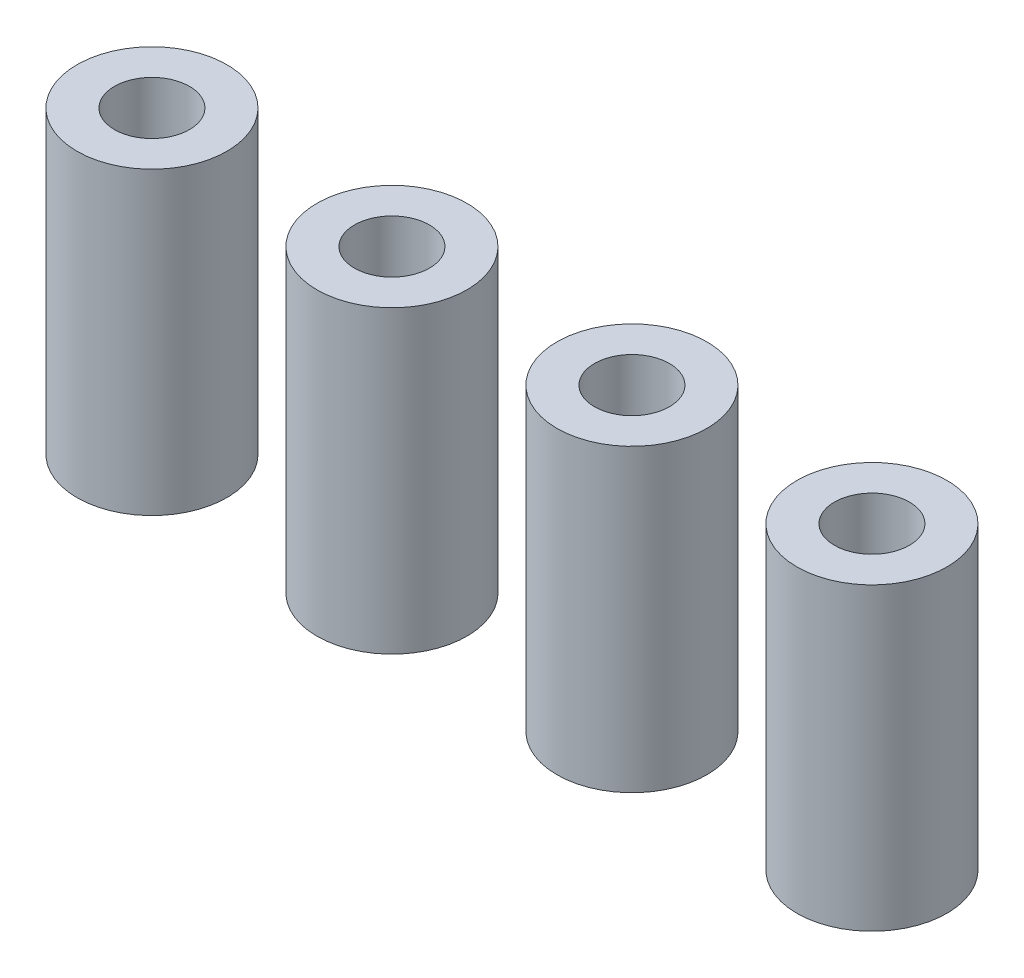
ISO-10303-21;
HEADER;
FILE_DESCRIPTION(('STEP AP214'),'2;1');
FILE_NAME('part.step','',(''),(''),'','','');
FILE_SCHEMA(('AUTOMOTIVE_DESIGN { 1 0 10303 214 1 1 1 1 }'));
ENDSEC;
DATA;
#1=APPLICATION_CONTEXT('core data for automotive mechanical design processes');
#2=APPLICATION_PROTOCOL_DEFINITION('international standard','automotive_design',2000,#1);
#3=PRODUCT_CONTEXT('',#1,'mechanical');
#4=PRODUCT('Part','Part','',(#3));
#5=PRODUCT_RELATED_PRODUCT_CATEGORY('part','',(#4));
#6=PRODUCT_DEFINITION_FORMATION('','',#4);
#7=PRODUCT_DEFINITION_CONTEXT('part definition',#1,'design');
#8=PRODUCT_DEFINITION('design','',#6,#7);
#9=PRODUCT_DEFINITION_SHAPE('','',#8);
#10=(LENGTH_UNIT() NAMED_UNIT(*) SI_UNIT(.MILLI.,.METRE.));
#11=(NAMED_UNIT(*) PLANE_ANGLE_UNIT() SI_UNIT($,.RADIAN.));
#12=(NAMED_UNIT(*) SI_UNIT($,.STERADIAN.) SOLID_ANGLE_UNIT());
#13=UNCERTAINTY_MEASURE_WITH_UNIT(LENGTH_MEASURE(1.E-05),#10,'distance_accuracy_value','');
#14=(GEOMETRIC_REPRESENTATION_CONTEXT(3) GLOBAL_UNCERTAINTY_ASSIGNED_CONTEXT((#13)) GLOBAL_UNIT_ASSIGNED_CONTEXT((#10,
#11,#12)) REPRESENTATION_CONTEXT('',''));
#15=CARTESIAN_POINT('',(0.,0.,0.));
#16=DIRECTION('',(0.,0.,1.));
#17=DIRECTION('',(1.,0.,0.));
#18=AXIS2_PLACEMENT_3D('',#15,#16,#17);
#19=CARTESIAN_POINT('',(24.,10.,0.));
#20=DIRECTION('',(0.,1.,0.));
#21=DIRECTION('',(0.,0.,1.));
#22=AXIS2_PLACEMENT_3D('',#19,#20,#21);
#23=PLANE('',#22);
#24=CARTESIAN_POINT('',(24.,10.,0.));
#25=DIRECTION('',(0.,1.,0.));
#26=DIRECTION('',(0.,0.,1.));
#27=AXIS2_PLACEMENT_3D('',#24,#25,#26);
#28=CIRCLE('',#27,2.5);
#29=CARTESIAN_POINT('',(24.,10.,2.5));
#30=VERTEX_POINT('',#29);
#31=EDGE_CURVE('E11',#30,#30,#28,.T.);
#32=ORIENTED_EDGE('',*,*,#31,.T.);
#33=EDGE_LOOP('',(#32));
#34=FACE_BOUND('',#33,.T.);
#35=CARTESIAN_POINT('',(24.,10.,0.));
#36=DIRECTION('',(0.,1.,0.));
#37=DIRECTION('',(0.,0.,1.));
#38=AXIS2_PLACEMENT_3D('',#35,#36,#37);
#39=CIRCLE('',#38,1.25);
#40=CARTESIAN_POINT('',(24.,10.,1.25));
#41=VERTEX_POINT('',#40);
#42=EDGE_CURVE('E57',#41,#41,#39,.T.);
#43=ORIENTED_EDGE('',*,*,#42,.F.);
#44=EDGE_LOOP('',(#43));
#45=FACE_BOUND('',#44,.T.);
#46=ADVANCED_FACE('F46',(#34,#45),#23,.T.);
#47=CARTESIAN_POINT('',(24.,0.,0.));
#48=DIRECTION('',(0.,1.,0.));
#49=DIRECTION('',(0.,0.,1.));
#50=AXIS2_PLACEMENT_3D('',#47,#48,#49);
#51=PLANE('',#50);
#52=CARTESIAN_POINT('',(24.,0.,0.));
#53=DIRECTION('',(0.,1.,0.));
#54=DIRECTION('',(0.,0.,1.));
#55=AXIS2_PLACEMENT_3D('',#52,#53,#54);
#56=CIRCLE('',#55,2.5);
#57=CARTESIAN_POINT('',(24.,0.,2.5));
#58=VERTEX_POINT('',#57);
#59=EDGE_CURVE('E50',#58,#58,#56,.T.);
#60=ORIENTED_EDGE('',*,*,#59,.F.);
#61=EDGE_LOOP('',(#60));
#62=FACE_BOUND('',#61,.T.);
#63=CARTESIAN_POINT('',(24.,0.,0.));
#64=DIRECTION('',(0.,1.,0.));
#65=DIRECTION('',(0.,0.,1.));
#66=AXIS2_PLACEMENT_3D('',#63,#64,#65);
#67=CIRCLE('',#66,1.25);
#68=CARTESIAN_POINT('',(24.,0.,1.25));
#69=VERTEX_POINT('',#68);
#70=EDGE_CURVE('E59',#69,#69,#67,.T.);
#71=ORIENTED_EDGE('',*,*,#70,.T.);
#72=EDGE_LOOP('',(#71));
#73=FACE_BOUND('',#72,.T.);
#74=ADVANCED_FACE('F69',(#62,#73),#51,.F.);
#75=CARTESIAN_POINT('',(24.,10.,0.));
#76=DIRECTION('',(0.,-1.,0.));
#77=DIRECTION('',(0.,0.,-1.));
#78=AXIS2_PLACEMENT_3D('',#75,#76,#77);
#79=CYLINDRICAL_SURFACE('',#78,2.5);
#80=ORIENTED_EDGE('',*,*,#31,.F.);
#81=EDGE_LOOP('',(#80));
#82=FACE_BOUND('',#81,.T.);
#83=ORIENTED_EDGE('',*,*,#59,.T.);
#84=EDGE_LOOP('',(#83));
#85=FACE_BOUND('',#84,.T.);
#86=ADVANCED_FACE('F48',(#82,#85),#79,.T.);
#87=CARTESIAN_POINT('',(24.,10.,0.));
#88=DIRECTION('',(0.,-1.,0.));
#89=DIRECTION('',(0.,0.,-1.));
#90=AXIS2_PLACEMENT_3D('',#87,#88,#89);
#91=CYLINDRICAL_SURFACE('',#90,1.25);
#92=ORIENTED_EDGE('',*,*,#42,.T.);
#93=EDGE_LOOP('',(#92));
#94=FACE_BOUND('',#93,.T.);
#95=ORIENTED_EDGE('',*,*,#70,.F.);
#96=EDGE_LOOP('',(#95));
#97=FACE_BOUND('',#96,.T.);
#98=ADVANCED_FACE('F65',(#94,#97),#91,.F.);
#99=CLOSED_SHELL('',(#46,#74,#86,#98));
#100=MANIFOLD_SOLID_BREP('B2',#99);
#101=CARTESIAN_POINT('',(16.,10.,0.));
#102=DIRECTION('',(0.,1.,0.));
#103=DIRECTION('',(0.,0.,1.));
#104=AXIS2_PLACEMENT_3D('',#101,#102,#103);
#105=PLANE('',#104);
#106=CARTESIAN_POINT('',(16.,10.,0.));
#107=DIRECTION('',(0.,1.,0.));
#108=DIRECTION('',(0.,0.,1.));
#109=AXIS2_PLACEMENT_3D('',#106,#107,#108);
#110=CIRCLE('',#109,2.5);
#111=CARTESIAN_POINT('',(16.,10.,2.5));
#112=VERTEX_POINT('',#111);
#113=EDGE_CURVE('E45',#112,#112,#110,.T.);
#114=ORIENTED_EDGE('',*,*,#113,.T.);
#115=EDGE_LOOP('',(#114));
#116=FACE_BOUND('',#115,.T.);
#117=CARTESIAN_POINT('',(16.,10.,0.));
#118=DIRECTION('',(0.,1.,0.));
#119=DIRECTION('',(0.,0.,1.));
#120=AXIS2_PLACEMENT_3D('',#117,#118,#119);
#121=CIRCLE('',#120,1.25);
#122=CARTESIAN_POINT('',(16.,10.,1.25));
#123=VERTEX_POINT('',#122);
#124=EDGE_CURVE('E129',#123,#123,#121,.T.);
#125=ORIENTED_EDGE('',*,*,#124,.F.);
#126=EDGE_LOOP('',(#125));
#127=FACE_BOUND('',#126,.T.);
#128=ADVANCED_FACE('F116',(#116,#127),#105,.T.);
#129=CARTESIAN_POINT('',(16.,0.,0.));
#130=DIRECTION('',(0.,1.,0.));
#131=DIRECTION('',(0.,0.,1.));
#132=AXIS2_PLACEMENT_3D('',#129,#130,#131);
#133=PLANE('',#132);
#134=CARTESIAN_POINT('',(16.,0.,0.));
#135=DIRECTION('',(0.,1.,0.));
#136=DIRECTION('',(0.,0.,1.));
#137=AXIS2_PLACEMENT_3D('',#134,#135,#136);
#138=CIRCLE('',#137,2.5);
#139=CARTESIAN_POINT('',(16.,0.,2.5));
#140=VERTEX_POINT('',#139);
#141=EDGE_CURVE('E120',#140,#140,#138,.T.);
#142=ORIENTED_EDGE('',*,*,#141,.F.);
#143=EDGE_LOOP('',(#142));
#144=FACE_BOUND('',#143,.T.);
#145=CARTESIAN_POINT('',(16.,0.,0.));
#146=DIRECTION('',(0.,1.,0.));
#147=DIRECTION('',(0.,0.,1.));
#148=AXIS2_PLACEMENT_3D('',#145,#146,#147);
#149=CIRCLE('',#148,1.25);
#150=CARTESIAN_POINT('',(16.,0.,1.25));
#151=VERTEX_POINT('',#150);
#152=EDGE_CURVE('E131',#151,#151,#149,.T.);
#153=ORIENTED_EDGE('',*,*,#152,.T.);
#154=EDGE_LOOP('',(#153));
#155=FACE_BOUND('',#154,.T.);
#156=ADVANCED_FACE('F143',(#144,#155),#133,.F.);
#157=CARTESIAN_POINT('',(16.,10.,0.));
#158=DIRECTION('',(0.,-1.,0.));
#159=DIRECTION('',(0.,0.,-1.));
#160=AXIS2_PLACEMENT_3D('',#157,#158,#159);
#161=CYLINDRICAL_SURFACE('',#160,2.5);
#162=ORIENTED_EDGE('',*,*,#113,.F.);
#163=EDGE_LOOP('',(#162));
#164=FACE_BOUND('',#163,.T.);
#165=ORIENTED_EDGE('',*,*,#141,.T.);
#166=EDGE_LOOP('',(#165));
#167=FACE_BOUND('',#166,.T.);
#168=ADVANCED_FACE('F118',(#164,#167),#161,.T.);
#169=CARTESIAN_POINT('',(16.,10.,0.));
#170=DIRECTION('',(0.,-1.,0.));
#171=DIRECTION('',(0.,0.,-1.));
#172=AXIS2_PLACEMENT_3D('',#169,#170,#171);
#173=CYLINDRICAL_SURFACE('',#172,1.25);
#174=ORIENTED_EDGE('',*,*,#124,.T.);
#175=EDGE_LOOP('',(#174));
#176=FACE_BOUND('',#175,.T.);
#177=ORIENTED_EDGE('',*,*,#152,.F.);
#178=EDGE_LOOP('',(#177));
#179=FACE_BOUND('',#178,.T.);
#180=ADVANCED_FACE('F139',(#176,#179),#173,.F.);
#181=CLOSED_SHELL('',(#128,#156,#168,#180));
#182=MANIFOLD_SOLID_BREP('B6',#181);
#183=CARTESIAN_POINT('',(8.,10.,0.));
#184=DIRECTION('',(0.,1.,0.));
#185=DIRECTION('',(0.,0.,1.));
#186=AXIS2_PLACEMENT_3D('',#183,#184,#185);
#187=PLANE('',#186);
#188=CARTESIAN_POINT('',(8.,10.,0.));
#189=DIRECTION('',(0.,1.,0.));
#190=DIRECTION('',(0.,0.,1.));
#191=AXIS2_PLACEMENT_3D('',#188,#189,#190);
#192=CIRCLE('',#191,2.5);
#193=CARTESIAN_POINT('',(8.,10.,2.5));
#194=VERTEX_POINT('',#193);
#195=EDGE_CURVE('E115',#194,#194,#192,.T.);
#196=ORIENTED_EDGE('',*,*,#195,.T.);
#197=EDGE_LOOP('',(#196));
#198=FACE_BOUND('',#197,.T.);
#199=CARTESIAN_POINT('',(8.,10.,0.));
#200=DIRECTION('',(0.,1.,0.));
#201=DIRECTION('',(0.,0.,1.));
#202=AXIS2_PLACEMENT_3D('',#199,#200,#201);
#203=CIRCLE('',#202,1.25);
#204=CARTESIAN_POINT('',(8.,10.,1.25));
#205=VERTEX_POINT('',#204);
#206=EDGE_CURVE('E200',#205,#205,#203,.T.);
#207=ORIENTED_EDGE('',*,*,#206,.F.);
#208=EDGE_LOOP('',(#207));
#209=FACE_BOUND('',#208,.T.);
#210=ADVANCED_FACE('F189',(#198,#209),#187,.T.);
#211=CARTESIAN_POINT('',(8.,0.,0.));
#212=DIRECTION('',(0.,1.,0.));
#213=DIRECTION('',(0.,0.,1.));
#214=AXIS2_PLACEMENT_3D('',#211,#212,#213);
#215=PLANE('',#214);
#216=CARTESIAN_POINT('',(8.,0.,0.));
#217=DIRECTION('',(0.,1.,0.));
#218=DIRECTION('',(0.,0.,1.));
#219=AXIS2_PLACEMENT_3D('',#216,#217,#218);
#220=CIRCLE('',#219,2.5);
#221=CARTESIAN_POINT('',(8.,0.,2.5));
#222=VERTEX_POINT('',#221);
#223=EDGE_CURVE('E193',#222,#222,#220,.T.);
#224=ORIENTED_EDGE('',*,*,#223,.F.);
#225=EDGE_LOOP('',(#224));
#226=FACE_BOUND('',#225,.T.);
#227=CARTESIAN_POINT('',(8.,0.,0.));
#228=DIRECTION('',(0.,1.,0.));
#229=DIRECTION('',(0.,0.,1.));
#230=AXIS2_PLACEMENT_3D('',#227,#228,#229);
#231=CIRCLE('',#230,1.25);
#232=CARTESIAN_POINT('',(8.,0.,1.25));
#233=VERTEX_POINT('',#232);
#234=EDGE_CURVE('E202',#233,#233,#231,.T.);
#235=ORIENTED_EDGE('',*,*,#234,.T.);
#236=EDGE_LOOP('',(#235));
#237=FACE_BOUND('',#236,.T.);
#238=ADVANCED_FACE('F212',(#226,#237),#215,.F.);
#239=CARTESIAN_POINT('',(8.,10.,0.));
#240=DIRECTION('',(0.,-1.,0.));
#241=DIRECTION('',(0.,0.,-1.));
#242=AXIS2_PLACEMENT_3D('',#239,#240,#241);
#243=CYLINDRICAL_SURFACE('',#242,2.5);
#244=ORIENTED_EDGE('',*,*,#195,.F.);
#245=EDGE_LOOP('',(#244));
#246=FACE_BOUND('',#245,.T.);
#247=ORIENTED_EDGE('',*,*,#223,.T.);
#248=EDGE_LOOP('',(#247));
#249=FACE_BOUND('',#248,.T.);
#250=ADVANCED_FACE('F191',(#246,#249),#243,.T.);
#251=CARTESIAN_POINT('',(8.,10.,0.));
#252=DIRECTION('',(0.,-1.,0.));
#253=DIRECTION('',(0.,0.,-1.));
#254=AXIS2_PLACEMENT_3D('',#251,#252,#253);
#255=CYLINDRICAL_SURFACE('',#254,1.25);
#256=ORIENTED_EDGE('',*,*,#206,.T.);
#257=EDGE_LOOP('',(#256));
#258=FACE_BOUND('',#257,.T.);
#259=ORIENTED_EDGE('',*,*,#234,.F.);
#260=EDGE_LOOP('',(#259));
#261=FACE_BOUND('',#260,.T.);
#262=ADVANCED_FACE('F208',(#258,#261),#255,.F.);
#263=CLOSED_SHELL('',(#210,#238,#250,#262));
#264=MANIFOLD_SOLID_BREP('B40',#263);
#265=CARTESIAN_POINT('',(0.,10.,0.));
#266=DIRECTION('',(0.,1.,0.));
#267=DIRECTION('',(0.,0.,1.));
#268=AXIS2_PLACEMENT_3D('',#265,#266,#267);
#269=PLANE('',#268);
#270=CARTESIAN_POINT('',(0.,10.,0.));
#271=DIRECTION('',(0.,1.,0.));
#272=DIRECTION('',(0.,0.,1.));
#273=AXIS2_PLACEMENT_3D('',#270,#271,#272);
#274=CIRCLE('',#273,2.5);
#275=CARTESIAN_POINT('',(0.,10.,2.5));
#276=VERTEX_POINT('',#275);
#277=EDGE_CURVE('E188',#276,#276,#274,.T.);
#278=ORIENTED_EDGE('',*,*,#277,.T.);
#279=EDGE_LOOP('',(#278));
#280=FACE_BOUND('',#279,.T.);
#281=CARTESIAN_POINT('',(0.,10.,0.));
#282=DIRECTION('',(0.,1.,0.));
#283=DIRECTION('',(0.,0.,1.));
#284=AXIS2_PLACEMENT_3D('',#281,#282,#283);
#285=CIRCLE('',#284,1.25);
#286=CARTESIAN_POINT('',(0.,10.,1.25));
#287=VERTEX_POINT('',#286);
#288=EDGE_CURVE('E262',#287,#287,#285,.T.);
#289=ORIENTED_EDGE('',*,*,#288,.F.);
#290=EDGE_LOOP('',(#289));
#291=FACE_BOUND('',#290,.T.);
#292=ADVANCED_FACE('F251',(#280,#291),#269,.T.);
#293=CARTESIAN_POINT('',(0.,0.,0.));
#294=DIRECTION('',(0.,1.,0.));
#295=DIRECTION('',(0.,0.,1.));
#296=AXIS2_PLACEMENT_3D('',#293,#294,#295);
#297=PLANE('',#296);
#298=CARTESIAN_POINT('',(0.,0.,0.));
#299=DIRECTION('',(0.,1.,0.));
#300=DIRECTION('',(0.,0.,1.));
#301=AXIS2_PLACEMENT_3D('',#298,#299,#300);
#302=CIRCLE('',#301,2.5);
#303=CARTESIAN_POINT('',(0.,0.,2.5));
#304=VERTEX_POINT('',#303);
#305=EDGE_CURVE('E255',#304,#304,#302,.T.);
#306=ORIENTED_EDGE('',*,*,#305,.F.);
#307=EDGE_LOOP('',(#306));
#308=FACE_BOUND('',#307,.T.);
#309=CARTESIAN_POINT('',(0.,0.,0.));
#310=DIRECTION('',(0.,1.,0.));
#311=DIRECTION('',(0.,0.,1.));
#312=AXIS2_PLACEMENT_3D('',#309,#310,#311);
#313=CIRCLE('',#312,1.25);
#314=CARTESIAN_POINT('',(0.,0.,1.25));
#315=VERTEX_POINT('',#314);
#316=EDGE_CURVE('E264',#315,#315,#313,.T.);
#317=ORIENTED_EDGE('',*,*,#316,.T.);
#318=EDGE_LOOP('',(#317));
#319=FACE_BOUND('',#318,.T.);
#320=ADVANCED_FACE('F274',(#308,#319),#297,.F.);
#321=CARTESIAN_POINT('',(0.,10.,0.));
#322=DIRECTION('',(0.,-1.,0.));
#323=DIRECTION('',(0.,0.,-1.));
#324=AXIS2_PLACEMENT_3D('',#321,#322,#323);
#325=CYLINDRICAL_SURFACE('',#324,2.5);
#326=ORIENTED_EDGE('',*,*,#277,.F.);
#327=EDGE_LOOP('',(#326));
#328=FACE_BOUND('',#327,.T.);
#329=ORIENTED_EDGE('',*,*,#305,.T.);
#330=EDGE_LOOP('',(#329));
#331=FACE_BOUND('',#330,.T.);
#332=ADVANCED_FACE('F253',(#328,#331),#325,.T.);
#333=CARTESIAN_POINT('',(0.,10.,0.));
#334=DIRECTION('',(0.,-1.,0.));
#335=DIRECTION('',(0.,0.,-1.));
#336=AXIS2_PLACEMENT_3D('',#333,#334,#335);
#337=CYLINDRICAL_SURFACE('',#336,1.25);
#338=ORIENTED_EDGE('',*,*,#288,.T.);
#339=EDGE_LOOP('',(#338));
#340=FACE_BOUND('',#339,.T.);
#341=ORIENTED_EDGE('',*,*,#316,.F.);
#342=EDGE_LOOP('',(#341));
#343=FACE_BOUND('',#342,.T.);
#344=ADVANCED_FACE('F270',(#340,#343),#337,.F.);
#345=CLOSED_SHELL('',(#292,#320,#332,#344));
#346=MANIFOLD_SOLID_BREP('B110',#345);
#347=ADVANCED_BREP_SHAPE_REPRESENTATION('',(#18,#100,#182,#264,#346),#14);
#348=SHAPE_DEFINITION_REPRESENTATION(#9,#347);
ENDSEC;
END-ISO-10303-21;
